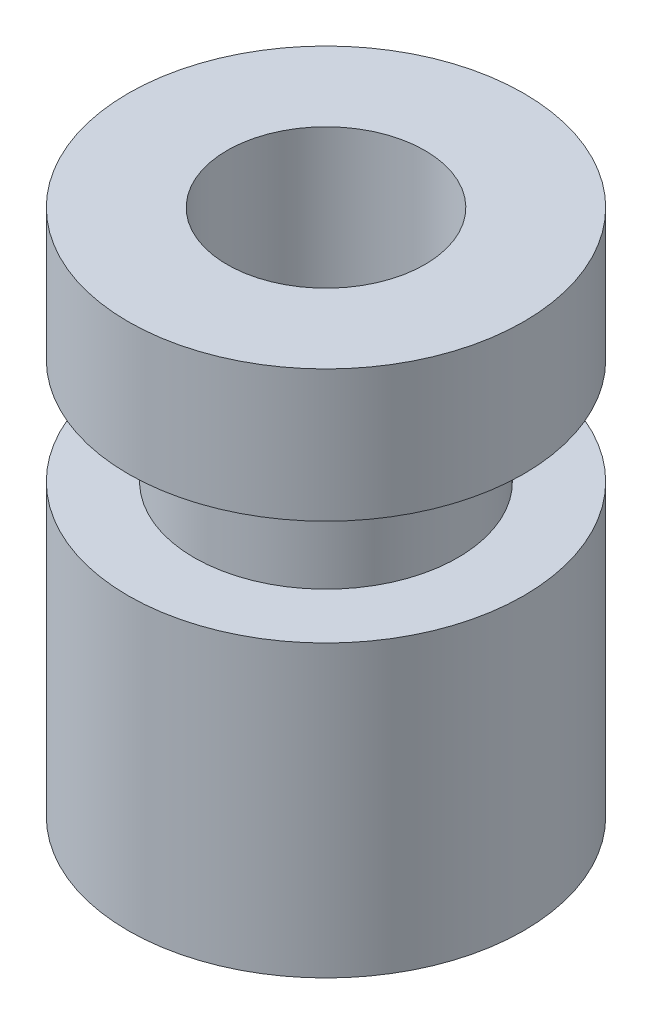
ISO-10303-21;
HEADER;
FILE_DESCRIPTION(('STEP AP214'),'2;1');
FILE_NAME('part.step','',(''),(''),'','','');
FILE_SCHEMA(('AUTOMOTIVE_DESIGN { 1 0 10303 214 1 1 1 1 }'));
ENDSEC;
DATA;
#1=APPLICATION_CONTEXT('core data for automotive mechanical design processes');
#2=APPLICATION_PROTOCOL_DEFINITION('international standard','automotive_design',2000,#1);
#3=PRODUCT_CONTEXT('',#1,'mechanical');
#4=PRODUCT('Part','Part','',(#3));
#5=PRODUCT_RELATED_PRODUCT_CATEGORY('part','',(#4));
#6=PRODUCT_DEFINITION_FORMATION('','',#4);
#7=PRODUCT_DEFINITION_CONTEXT('part definition',#1,'design');
#8=PRODUCT_DEFINITION('design','',#6,#7);
#9=PRODUCT_DEFINITION_SHAPE('','',#8);
#10=(LENGTH_UNIT() NAMED_UNIT(*) SI_UNIT(.MILLI.,.METRE.));
#11=(NAMED_UNIT(*) PLANE_ANGLE_UNIT() SI_UNIT($,.RADIAN.));
#12=(NAMED_UNIT(*) SI_UNIT($,.STERADIAN.) SOLID_ANGLE_UNIT());
#13=UNCERTAINTY_MEASURE_WITH_UNIT(LENGTH_MEASURE(1.E-05),#10,'distance_accuracy_value','');
#14=(GEOMETRIC_REPRESENTATION_CONTEXT(3) GLOBAL_UNCERTAINTY_ASSIGNED_CONTEXT((#13)) GLOBAL_UNIT_ASSIGNED_CONTEXT((#10,
#11,#12)) REPRESENTATION_CONTEXT('',''));
#15=CARTESIAN_POINT('',(0.,0.,0.));
#16=DIRECTION('',(0.,0.,1.));
#17=DIRECTION('',(1.,0.,0.));
#18=AXIS2_PLACEMENT_3D('',#15,#16,#17);
#19=CARTESIAN_POINT('',(0.,0.,0.));
#20=DIRECTION('',(0.,-1.,0.));
#21=DIRECTION('',(0.,0.,-1.));
#22=AXIS2_PLACEMENT_3D('',#19,#20,#21);
#23=CYLINDRICAL_SURFACE('',#22,1.5);
#24=CARTESIAN_POINT('',(0.,0.,0.));
#25=DIRECTION('',(0.,-1.,0.));
#26=DIRECTION('',(0.,0.,-1.));
#27=AXIS2_PLACEMENT_3D('',#24,#25,#26);
#28=CIRCLE('',#27,1.5);
#29=CARTESIAN_POINT('',(0.,0.,-1.5));
#30=VERTEX_POINT('',#29);
#31=EDGE_CURVE('E62',#30,#30,#28,.T.);
#32=ORIENTED_EDGE('',*,*,#31,.T.);
#33=EDGE_LOOP('',(#32));
#34=FACE_BOUND('',#33,.T.);
#35=CARTESIAN_POINT('',(0.,8.,0.));
#36=DIRECTION('',(0.,-1.,0.));
#37=DIRECTION('',(0.,0.,-1.));
#38=AXIS2_PLACEMENT_3D('',#35,#36,#37);
#39=CIRCLE('',#38,1.5);
#40=CARTESIAN_POINT('',(0.,8.,-1.5));
#41=VERTEX_POINT('',#40);
#42=EDGE_CURVE('E10',#41,#41,#39,.T.);
#43=ORIENTED_EDGE('',*,*,#42,.F.);
#44=EDGE_LOOP('',(#43));
#45=FACE_BOUND('',#44,.T.);
#46=ADVANCED_FACE('F34',(#34,#45),#23,.F.);
#47=CARTESIAN_POINT('',(1.5,8.,0.));
#48=DIRECTION('',(0.,1.,0.));
#49=DIRECTION('',(0.,0.,1.));
#50=AXIS2_PLACEMENT_3D('',#47,#48,#49);
#51=PLANE('',#50);
#52=ORIENTED_EDGE('',*,*,#42,.T.);
#53=EDGE_LOOP('',(#52));
#54=FACE_BOUND('',#53,.T.);
#55=CARTESIAN_POINT('',(0.,8.,0.));
#56=DIRECTION('',(0.,-1.,0.));
#57=DIRECTION('',(0.,0.,-1.));
#58=AXIS2_PLACEMENT_3D('',#55,#56,#57);
#59=CIRCLE('',#58,3.);
#60=CARTESIAN_POINT('',(0.,8.,-3.));
#61=VERTEX_POINT('',#60);
#62=EDGE_CURVE('E40',#61,#61,#59,.T.);
#63=ORIENTED_EDGE('',*,*,#62,.F.);
#64=EDGE_LOOP('',(#63));
#65=FACE_BOUND('',#64,.T.);
#66=ADVANCED_FACE('F80',(#54,#65),#51,.T.);
#67=CARTESIAN_POINT('',(0.,0.,0.));
#68=DIRECTION('',(0.,-1.,0.));
#69=DIRECTION('',(0.,0.,-1.));
#70=AXIS2_PLACEMENT_3D('',#67,#68,#69);
#71=CYLINDRICAL_SURFACE('',#70,3.);
#72=ORIENTED_EDGE('',*,*,#62,.T.);
#73=EDGE_LOOP('',(#72));
#74=FACE_BOUND('',#73,.T.);
#75=CARTESIAN_POINT('',(0.,6.,0.));
#76=DIRECTION('',(0.,-1.,0.));
#77=DIRECTION('',(0.,0.,-1.));
#78=AXIS2_PLACEMENT_3D('',#75,#76,#77);
#79=CIRCLE('',#78,3.);
#80=CARTESIAN_POINT('',(0.,6.,-3.));
#81=VERTEX_POINT('',#80);
#82=EDGE_CURVE('E44',#81,#81,#79,.T.);
#83=ORIENTED_EDGE('',*,*,#82,.F.);
#84=EDGE_LOOP('',(#83));
#85=FACE_BOUND('',#84,.T.);
#86=ADVANCED_FACE('F84',(#74,#85),#71,.T.);
#87=CARTESIAN_POINT('',(3.,6.,0.));
#88=DIRECTION('',(0.,-1.,0.));
#89=DIRECTION('',(0.,0.,-1.));
#90=AXIS2_PLACEMENT_3D('',#87,#88,#89);
#91=PLANE('',#90);
#92=ORIENTED_EDGE('',*,*,#82,.T.);
#93=EDGE_LOOP('',(#92));
#94=FACE_BOUND('',#93,.T.);
#95=CARTESIAN_POINT('',(0.,6.,0.));
#96=DIRECTION('',(0.,-1.,0.));
#97=DIRECTION('',(0.,0.,-1.));
#98=AXIS2_PLACEMENT_3D('',#95,#96,#97);
#99=CIRCLE('',#98,2.);
#100=CARTESIAN_POINT('',(0.,6.,-2.));
#101=VERTEX_POINT('',#100);
#102=EDGE_CURVE('E48',#101,#101,#99,.T.);
#103=ORIENTED_EDGE('',*,*,#102,.F.);
#104=EDGE_LOOP('',(#103));
#105=FACE_BOUND('',#104,.T.);
#106=ADVANCED_FACE('F88',(#94,#105),#91,.T.);
#107=CARTESIAN_POINT('',(0.,0.,0.));
#108=DIRECTION('',(0.,-1.,0.));
#109=DIRECTION('',(0.,0.,-1.));
#110=AXIS2_PLACEMENT_3D('',#107,#108,#109);
#111=CYLINDRICAL_SURFACE('',#110,2.);
#112=ORIENTED_EDGE('',*,*,#102,.T.);
#113=EDGE_LOOP('',(#112));
#114=FACE_BOUND('',#113,.T.);
#115=CARTESIAN_POINT('',(0.,4.4,0.));
#116=DIRECTION('',(0.,-1.,0.));
#117=DIRECTION('',(0.,0.,-1.));
#118=AXIS2_PLACEMENT_3D('',#115,#116,#117);
#119=CIRCLE('',#118,2.);
#120=CARTESIAN_POINT('',(0.,4.4,-2.));
#121=VERTEX_POINT('',#120);
#122=EDGE_CURVE('E53',#121,#121,#119,.T.);
#123=ORIENTED_EDGE('',*,*,#122,.F.);
#124=EDGE_LOOP('',(#123));
#125=FACE_BOUND('',#124,.T.);
#126=ADVANCED_FACE('F94',(#114,#125),#111,.T.);
#127=CARTESIAN_POINT('',(2.,4.4,0.));
#128=DIRECTION('',(0.,1.,0.));
#129=DIRECTION('',(0.,0.,1.));
#130=AXIS2_PLACEMENT_3D('',#127,#128,#129);
#131=PLANE('',#130);
#132=ORIENTED_EDGE('',*,*,#122,.T.);
#133=EDGE_LOOP('',(#132));
#134=FACE_BOUND('',#133,.T.);
#135=CARTESIAN_POINT('',(0.,4.4,0.));
#136=DIRECTION('',(0.,-1.,0.));
#137=DIRECTION('',(0.,0.,-1.));
#138=AXIS2_PLACEMENT_3D('',#135,#136,#137);
#139=CIRCLE('',#138,3.);
#140=CARTESIAN_POINT('',(0.,4.4,-3.));
#141=VERTEX_POINT('',#140);
#142=EDGE_CURVE('E56',#141,#141,#139,.T.);
#143=ORIENTED_EDGE('',*,*,#142,.F.);
#144=EDGE_LOOP('',(#143));
#145=FACE_BOUND('',#144,.T.);
#146=ADVANCED_FACE('F76',(#134,#145),#131,.T.);
#147=CARTESIAN_POINT('',(0.,0.,0.));
#148=DIRECTION('',(0.,-1.,0.));
#149=DIRECTION('',(0.,0.,-1.));
#150=AXIS2_PLACEMENT_3D('',#147,#148,#149);
#151=CYLINDRICAL_SURFACE('',#150,3.);
#152=ORIENTED_EDGE('',*,*,#142,.T.);
#153=EDGE_LOOP('',(#152));
#154=FACE_BOUND('',#153,.T.);
#155=CARTESIAN_POINT('',(0.,0.,0.));
#156=DIRECTION('',(0.,-1.,0.));
#157=DIRECTION('',(0.,0.,-1.));
#158=AXIS2_PLACEMENT_3D('',#155,#156,#157);
#159=CIRCLE('',#158,3.);
#160=CARTESIAN_POINT('',(0.,0.,-3.));
#161=VERTEX_POINT('',#160);
#162=EDGE_CURVE('E59',#161,#161,#159,.T.);
#163=ORIENTED_EDGE('',*,*,#162,.F.);
#164=EDGE_LOOP('',(#163));
#165=FACE_BOUND('',#164,.T.);
#166=ADVANCED_FACE('F70',(#154,#165),#151,.T.);
#167=CARTESIAN_POINT('',(3.,0.,0.));
#168=DIRECTION('',(0.,-1.,0.));
#169=DIRECTION('',(0.,0.,-1.));
#170=AXIS2_PLACEMENT_3D('',#167,#168,#169);
#171=PLANE('',#170);
#172=ORIENTED_EDGE('',*,*,#162,.T.);
#173=EDGE_LOOP('',(#172));
#174=FACE_BOUND('',#173,.T.);
#175=ORIENTED_EDGE('',*,*,#31,.F.);
#176=EDGE_LOOP('',(#175));
#177=FACE_BOUND('',#176,.T.);
#178=ADVANCED_FACE('F68',(#174,#177),#171,.T.);
#179=CLOSED_SHELL('',(#46,#66,#86,#106,#126,#146,#166,#178));
#180=MANIFOLD_SOLID_BREP('B2',#179);
#181=ADVANCED_BREP_SHAPE_REPRESENTATION('',(#18,#180),#14);
#182=SHAPE_DEFINITION_REPRESENTATION(#9,#181);
ENDSEC;
END-ISO-10303-21;
